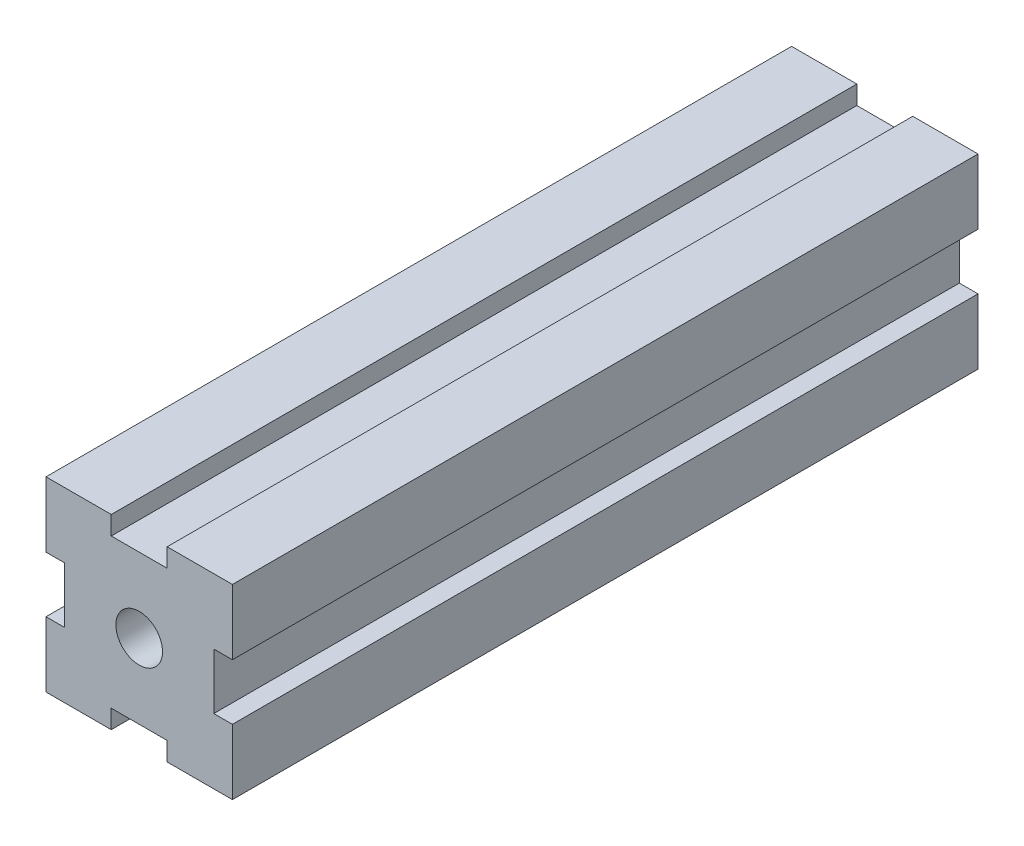
ISO-10303-21;
HEADER;
FILE_DESCRIPTION(('STEP AP214'),'2;1');
FILE_NAME('part.step','',(''),(''),'','','');
FILE_SCHEMA(('AUTOMOTIVE_DESIGN { 1 0 10303 214 1 1 1 1 }'));
ENDSEC;
DATA;
#1=APPLICATION_CONTEXT('core data for automotive mechanical design processes');
#2=APPLICATION_PROTOCOL_DEFINITION('international standard','automotive_design',2000,#1);
#3=PRODUCT_CONTEXT('',#1,'mechanical');
#4=PRODUCT('Part','Part','',(#3));
#5=PRODUCT_RELATED_PRODUCT_CATEGORY('part','',(#4));
#6=PRODUCT_DEFINITION_FORMATION('','',#4);
#7=PRODUCT_DEFINITION_CONTEXT('part definition',#1,'design');
#8=PRODUCT_DEFINITION('design','',#6,#7);
#9=PRODUCT_DEFINITION_SHAPE('','',#8);
#10=(LENGTH_UNIT() NAMED_UNIT(*) SI_UNIT(.MILLI.,.METRE.));
#11=(NAMED_UNIT(*) PLANE_ANGLE_UNIT() SI_UNIT($,.RADIAN.));
#12=(NAMED_UNIT(*) SI_UNIT($,.STERADIAN.) SOLID_ANGLE_UNIT());
#13=UNCERTAINTY_MEASURE_WITH_UNIT(LENGTH_MEASURE(1.E-05),#10,'distance_accuracy_value','');
#14=(GEOMETRIC_REPRESENTATION_CONTEXT(3) GLOBAL_UNCERTAINTY_ASSIGNED_CONTEXT((#13)) GLOBAL_UNIT_ASSIGNED_CONTEXT((#10,
#11,#12)) REPRESENTATION_CONTEXT('',''));
#15=CARTESIAN_POINT('',(0.,0.,0.));
#16=DIRECTION('',(0.,0.,1.));
#17=DIRECTION('',(1.,0.,0.));
#18=AXIS2_PLACEMENT_3D('',#15,#16,#17);
#19=CARTESIAN_POINT('',(0.,0.,80.));
#20=DIRECTION('',(0.,0.,1.));
#21=DIRECTION('',(1.,0.,0.));
#22=AXIS2_PLACEMENT_3D('',#19,#20,#21);
#23=PLANE('',#22);
#24=DIRECTION('',(0.,-1.,0.));
#25=VECTOR('',#24,1.);
#26=CARTESIAN_POINT('',(0.,0.,80.));
#27=LINE('',#26,#25);
#28=CARTESIAN_POINT('',(0.,0.,80.));
#29=VERTEX_POINT('',#28);
#30=CARTESIAN_POINT('',(0.,-7.,80.));
#31=VERTEX_POINT('',#30);
#32=EDGE_CURVE('E242',#29,#31,#27,.T.);
#33=ORIENTED_EDGE('',*,*,#32,.T.);
#34=DIRECTION('',(1.,0.,0.));
#35=VECTOR('',#34,1.);
#36=CARTESIAN_POINT('',(0.,-7.,80.));
#37=LINE('',#36,#35);
#38=CARTESIAN_POINT('',(2.,-7.,80.));
#39=VERTEX_POINT('',#38);
#40=EDGE_CURVE('E130',#31,#39,#37,.T.);
#41=ORIENTED_EDGE('',*,*,#40,.T.);
#42=DIRECTION('',(0.,-1.,0.));
#43=VECTOR('',#42,1.);
#44=CARTESIAN_POINT('',(2.,-7.,80.));
#45=LINE('',#44,#43);
#46=CARTESIAN_POINT('',(2.,-13.,80.));
#47=VERTEX_POINT('',#46);
#48=EDGE_CURVE('E293',#39,#47,#45,.T.);
#49=ORIENTED_EDGE('',*,*,#48,.T.);
#50=DIRECTION('',(-1.,0.,0.));
#51=VECTOR('',#50,1.);
#52=CARTESIAN_POINT('',(0.,-13.,80.));
#53=LINE('',#52,#51);
#54=CARTESIAN_POINT('',(0.,-13.,80.));
#55=VERTEX_POINT('',#54);
#56=EDGE_CURVE('E312',#47,#55,#53,.T.);
#57=ORIENTED_EDGE('',*,*,#56,.T.);
#58=DIRECTION('',(0.,-1.,0.));
#59=VECTOR('',#58,1.);
#60=CARTESIAN_POINT('',(0.,-13.,80.));
#61=LINE('',#60,#59);
#62=CARTESIAN_POINT('',(0.,-20.,80.));
#63=VERTEX_POINT('',#62);
#64=EDGE_CURVE('E309',#55,#63,#61,.T.);
#65=ORIENTED_EDGE('',*,*,#64,.T.);
#66=DIRECTION('',(1.,0.,0.));
#67=VECTOR('',#66,1.);
#68=CARTESIAN_POINT('',(0.,-20.,80.));
#69=LINE('',#68,#67);
#70=CARTESIAN_POINT('',(7.,-20.,80.));
#71=VERTEX_POINT('',#70);
#72=EDGE_CURVE('E311',#63,#71,#69,.T.);
#73=ORIENTED_EDGE('',*,*,#72,.T.);
#74=DIRECTION('',(0.,1.,0.));
#75=VECTOR('',#74,1.);
#76=CARTESIAN_POINT('',(7.,-20.,80.));
#77=LINE('',#76,#75);
#78=CARTESIAN_POINT('',(7.,-18.,80.));
#79=VERTEX_POINT('',#78);
#80=EDGE_CURVE('E314',#71,#79,#77,.T.);
#81=ORIENTED_EDGE('',*,*,#80,.T.);
#82=DIRECTION('',(1.,0.,0.));
#83=VECTOR('',#82,1.);
#84=CARTESIAN_POINT('',(7.,-18.,80.));
#85=LINE('',#84,#83);
#86=CARTESIAN_POINT('',(13.,-18.,80.));
#87=VERTEX_POINT('',#86);
#88=EDGE_CURVE('E320',#79,#87,#85,.T.);
#89=ORIENTED_EDGE('',*,*,#88,.T.);
#90=DIRECTION('',(0.,-1.,0.));
#91=VECTOR('',#90,1.);
#92=CARTESIAN_POINT('',(13.,-20.,80.));
#93=LINE('',#92,#91);
#94=CARTESIAN_POINT('',(13.,-20.,80.));
#95=VERTEX_POINT('',#94);
#96=EDGE_CURVE('E322',#87,#95,#93,.T.);
#97=ORIENTED_EDGE('',*,*,#96,.T.);
#98=DIRECTION('',(1.,0.,0.));
#99=VECTOR('',#98,1.);
#100=CARTESIAN_POINT('',(13.,-20.,80.));
#101=LINE('',#100,#99);
#102=CARTESIAN_POINT('',(20.,-20.,80.));
#103=VERTEX_POINT('',#102);
#104=EDGE_CURVE('E324',#95,#103,#101,.T.);
#105=ORIENTED_EDGE('',*,*,#104,.T.);
#106=DIRECTION('',(0.,1.,0.));
#107=VECTOR('',#106,1.);
#108=CARTESIAN_POINT('',(20.,-13.,80.));
#109=LINE('',#108,#107);
#110=CARTESIAN_POINT('',(20.,-13.,80.));
#111=VERTEX_POINT('',#110);
#112=EDGE_CURVE('E326',#103,#111,#109,.T.);
#113=ORIENTED_EDGE('',*,*,#112,.T.);
#114=DIRECTION('',(-1.,0.,0.));
#115=VECTOR('',#114,1.);
#116=CARTESIAN_POINT('',(20.,-13.,80.));
#117=LINE('',#116,#115);
#118=CARTESIAN_POINT('',(18.,-13.,80.));
#119=VERTEX_POINT('',#118);
#120=EDGE_CURVE('E328',#111,#119,#117,.T.);
#121=ORIENTED_EDGE('',*,*,#120,.T.);
#122=DIRECTION('',(0.,1.,0.));
#123=VECTOR('',#122,1.);
#124=CARTESIAN_POINT('',(18.,-7.,80.));
#125=LINE('',#124,#123);
#126=CARTESIAN_POINT('',(18.,-7.,80.));
#127=VERTEX_POINT('',#126);
#128=EDGE_CURVE('E330',#119,#127,#125,.T.);
#129=ORIENTED_EDGE('',*,*,#128,.T.);
#130=DIRECTION('',(1.,0.,0.));
#131=VECTOR('',#130,1.);
#132=CARTESIAN_POINT('',(20.,-7.,80.));
#133=LINE('',#132,#131);
#134=CARTESIAN_POINT('',(20.,-7.,80.));
#135=VERTEX_POINT('',#134);
#136=EDGE_CURVE('E332',#127,#135,#133,.T.);
#137=ORIENTED_EDGE('',*,*,#136,.T.);
#138=DIRECTION('',(0.,1.,0.));
#139=VECTOR('',#138,1.);
#140=CARTESIAN_POINT('',(20.,0.,80.));
#141=LINE('',#140,#139);
#142=CARTESIAN_POINT('',(20.,0.,80.));
#143=VERTEX_POINT('',#142);
#144=EDGE_CURVE('E334',#135,#143,#141,.T.);
#145=ORIENTED_EDGE('',*,*,#144,.T.);
#146=DIRECTION('',(-1.,0.,0.));
#147=VECTOR('',#146,1.);
#148=CARTESIAN_POINT('',(13.,0.,80.));
#149=LINE('',#148,#147);
#150=CARTESIAN_POINT('',(13.,0.,80.));
#151=VERTEX_POINT('',#150);
#152=EDGE_CURVE('E336',#143,#151,#149,.T.);
#153=ORIENTED_EDGE('',*,*,#152,.T.);
#154=DIRECTION('',(0.,-1.,0.));
#155=VECTOR('',#154,1.);
#156=CARTESIAN_POINT('',(13.,0.,80.));
#157=LINE('',#156,#155);
#158=CARTESIAN_POINT('',(13.,-2.,80.));
#159=VERTEX_POINT('',#158);
#160=EDGE_CURVE('E185',#151,#159,#157,.T.);
#161=ORIENTED_EDGE('',*,*,#160,.T.);
#162=DIRECTION('',(-1.,0.,0.));
#163=VECTOR('',#162,1.);
#164=CARTESIAN_POINT('',(7.,-2.,80.));
#165=LINE('',#164,#163);
#166=CARTESIAN_POINT('',(7.,-2.,80.));
#167=VERTEX_POINT('',#166);
#168=EDGE_CURVE('E179',#159,#167,#165,.T.);
#169=ORIENTED_EDGE('',*,*,#168,.T.);
#170=DIRECTION('',(0.,1.,0.));
#171=VECTOR('',#170,1.);
#172=CARTESIAN_POINT('',(7.,0.,80.));
#173=LINE('',#172,#171);
#174=CARTESIAN_POINT('',(7.,0.,80.));
#175=VERTEX_POINT('',#174);
#176=EDGE_CURVE('E183',#167,#175,#173,.T.);
#177=ORIENTED_EDGE('',*,*,#176,.T.);
#178=DIRECTION('',(-1.,0.,0.));
#179=VECTOR('',#178,1.);
#180=CARTESIAN_POINT('',(0.,0.,80.));
#181=LINE('',#180,#179);
#182=EDGE_CURVE('E51',#175,#29,#181,.T.);
#183=ORIENTED_EDGE('',*,*,#182,.T.);
#184=EDGE_LOOP('',(#33,#41,#49,#57,#65,#73,#81,#89,#97,#105,#113,#121,#129,#137,#145,#153,#161,
#169,#177,#183));
#185=FACE_BOUND('',#184,.T.);
#186=CARTESIAN_POINT('',(10.,-10.,80.));
#187=DIRECTION('',(0.,0.,1.));
#188=DIRECTION('',(1.,0.,0.));
#189=AXIS2_PLACEMENT_3D('',#186,#187,#188);
#190=CIRCLE('',#189,2.5);
#191=CARTESIAN_POINT('',(12.5,-10.,80.));
#192=VERTEX_POINT('',#191);
#193=EDGE_CURVE('E207',#192,#192,#190,.T.);
#194=ORIENTED_EDGE('',*,*,#193,.F.);
#195=EDGE_LOOP('',(#194));
#196=FACE_BOUND('',#195,.T.);
#197=ADVANCED_FACE('F34',(#185,#196),#23,.T.);
#198=CARTESIAN_POINT('',(0.,0.,0.));
#199=DIRECTION('',(0.,0.,1.));
#200=DIRECTION('',(1.,0.,0.));
#201=AXIS2_PLACEMENT_3D('',#198,#199,#200);
#202=PLANE('',#201);
#203=DIRECTION('',(0.,-1.,0.));
#204=VECTOR('',#203,1.);
#205=CARTESIAN_POINT('',(0.,0.,0.));
#206=LINE('',#205,#204);
#207=CARTESIAN_POINT('',(0.,0.,0.));
#208=VERTEX_POINT('',#207);
#209=CARTESIAN_POINT('',(0.,-7.,0.));
#210=VERTEX_POINT('',#209);
#211=EDGE_CURVE('E203',#208,#210,#206,.T.);
#212=ORIENTED_EDGE('',*,*,#211,.F.);
#213=DIRECTION('',(-1.,0.,0.));
#214=VECTOR('',#213,1.);
#215=CARTESIAN_POINT('',(0.,0.,0.));
#216=LINE('',#215,#214);
#217=CARTESIAN_POINT('',(7.,0.,0.));
#218=VERTEX_POINT('',#217);
#219=EDGE_CURVE('E122',#218,#208,#216,.T.);
#220=ORIENTED_EDGE('',*,*,#219,.F.);
#221=DIRECTION('',(0.,1.,0.));
#222=VECTOR('',#221,1.);
#223=CARTESIAN_POINT('',(7.,0.,0.));
#224=LINE('',#223,#222);
#225=CARTESIAN_POINT('',(7.,-2.,0.));
#226=VERTEX_POINT('',#225);
#227=EDGE_CURVE('E116',#226,#218,#224,.T.);
#228=ORIENTED_EDGE('',*,*,#227,.F.);
#229=DIRECTION('',(-1.,0.,0.));
#230=VECTOR('',#229,1.);
#231=CARTESIAN_POINT('',(7.,-2.,0.));
#232=LINE('',#231,#230);
#233=CARTESIAN_POINT('',(13.,-2.,0.));
#234=VERTEX_POINT('',#233);
#235=EDGE_CURVE('E193',#234,#226,#232,.T.);
#236=ORIENTED_EDGE('',*,*,#235,.F.);
#237=DIRECTION('',(0.,-1.,0.));
#238=VECTOR('',#237,1.);
#239=CARTESIAN_POINT('',(13.,0.,0.));
#240=LINE('',#239,#238);
#241=CARTESIAN_POINT('',(13.,0.,0.));
#242=VERTEX_POINT('',#241);
#243=EDGE_CURVE('E237',#242,#234,#240,.T.);
#244=ORIENTED_EDGE('',*,*,#243,.F.);
#245=DIRECTION('',(-1.,0.,0.));
#246=VECTOR('',#245,1.);
#247=CARTESIAN_POINT('',(13.,0.,0.));
#248=LINE('',#247,#246);
#249=CARTESIAN_POINT('',(20.,0.,0.));
#250=VERTEX_POINT('',#249);
#251=EDGE_CURVE('E235',#250,#242,#248,.T.);
#252=ORIENTED_EDGE('',*,*,#251,.F.);
#253=DIRECTION('',(0.,1.,0.));
#254=VECTOR('',#253,1.);
#255=CARTESIAN_POINT('',(20.,0.,0.));
#256=LINE('',#255,#254);
#257=CARTESIAN_POINT('',(20.,-7.,0.));
#258=VERTEX_POINT('',#257);
#259=EDGE_CURVE('E233',#258,#250,#256,.T.);
#260=ORIENTED_EDGE('',*,*,#259,.F.);
#261=DIRECTION('',(1.,0.,0.));
#262=VECTOR('',#261,1.);
#263=CARTESIAN_POINT('',(20.,-7.,0.));
#264=LINE('',#263,#262);
#265=CARTESIAN_POINT('',(18.,-7.,0.));
#266=VERTEX_POINT('',#265);
#267=EDGE_CURVE('E231',#266,#258,#264,.T.);
#268=ORIENTED_EDGE('',*,*,#267,.F.);
#269=DIRECTION('',(0.,1.,0.));
#270=VECTOR('',#269,1.);
#271=CARTESIAN_POINT('',(18.,-7.,0.));
#272=LINE('',#271,#270);
#273=CARTESIAN_POINT('',(18.,-13.,0.));
#274=VERTEX_POINT('',#273);
#275=EDGE_CURVE('E229',#274,#266,#272,.T.);
#276=ORIENTED_EDGE('',*,*,#275,.F.);
#277=DIRECTION('',(-1.,0.,0.));
#278=VECTOR('',#277,1.);
#279=CARTESIAN_POINT('',(20.,-13.,0.));
#280=LINE('',#279,#278);
#281=CARTESIAN_POINT('',(20.,-13.,0.));
#282=VERTEX_POINT('',#281);
#283=EDGE_CURVE('E227',#282,#274,#280,.T.);
#284=ORIENTED_EDGE('',*,*,#283,.F.);
#285=DIRECTION('',(0.,1.,0.));
#286=VECTOR('',#285,1.);
#287=CARTESIAN_POINT('',(20.,-13.,0.));
#288=LINE('',#287,#286);
#289=CARTESIAN_POINT('',(20.,-20.,0.));
#290=VERTEX_POINT('',#289);
#291=EDGE_CURVE('E225',#290,#282,#288,.T.);
#292=ORIENTED_EDGE('',*,*,#291,.F.);
#293=DIRECTION('',(1.,0.,0.));
#294=VECTOR('',#293,1.);
#295=CARTESIAN_POINT('',(13.,-20.,0.));
#296=LINE('',#295,#294);
#297=CARTESIAN_POINT('',(13.,-20.,0.));
#298=VERTEX_POINT('',#297);
#299=EDGE_CURVE('E223',#298,#290,#296,.T.);
#300=ORIENTED_EDGE('',*,*,#299,.F.);
#301=DIRECTION('',(0.,-1.,0.));
#302=VECTOR('',#301,1.);
#303=CARTESIAN_POINT('',(13.,-20.,0.));
#304=LINE('',#303,#302);
#305=CARTESIAN_POINT('',(13.,-18.,0.));
#306=VERTEX_POINT('',#305);
#307=EDGE_CURVE('E221',#306,#298,#304,.T.);
#308=ORIENTED_EDGE('',*,*,#307,.F.);
#309=DIRECTION('',(1.,0.,0.));
#310=VECTOR('',#309,1.);
#311=CARTESIAN_POINT('',(7.,-18.,0.));
#312=LINE('',#311,#310);
#313=CARTESIAN_POINT('',(7.,-18.,0.));
#314=VERTEX_POINT('',#313);
#315=EDGE_CURVE('E219',#314,#306,#312,.T.);
#316=ORIENTED_EDGE('',*,*,#315,.F.);
#317=DIRECTION('',(0.,1.,0.));
#318=VECTOR('',#317,1.);
#319=CARTESIAN_POINT('',(7.,-20.,0.));
#320=LINE('',#319,#318);
#321=CARTESIAN_POINT('',(7.,-20.,0.));
#322=VERTEX_POINT('',#321);
#323=EDGE_CURVE('E217',#322,#314,#320,.T.);
#324=ORIENTED_EDGE('',*,*,#323,.F.);
#325=DIRECTION('',(1.,0.,0.));
#326=VECTOR('',#325,1.);
#327=CARTESIAN_POINT('',(0.,-20.,0.));
#328=LINE('',#327,#326);
#329=CARTESIAN_POINT('',(0.,-20.,0.));
#330=VERTEX_POINT('',#329);
#331=EDGE_CURVE('E215',#330,#322,#328,.T.);
#332=ORIENTED_EDGE('',*,*,#331,.F.);
#333=DIRECTION('',(0.,-1.,0.));
#334=VECTOR('',#333,1.);
#335=CARTESIAN_POINT('',(0.,-13.,0.));
#336=LINE('',#335,#334);
#337=CARTESIAN_POINT('',(0.,-13.,0.));
#338=VERTEX_POINT('',#337);
#339=EDGE_CURVE('E213',#338,#330,#336,.T.);
#340=ORIENTED_EDGE('',*,*,#339,.F.);
#341=DIRECTION('',(-1.,0.,0.));
#342=VECTOR('',#341,1.);
#343=CARTESIAN_POINT('',(0.,-13.,0.));
#344=LINE('',#343,#342);
#345=CARTESIAN_POINT('',(2.,-13.,0.));
#346=VERTEX_POINT('',#345);
#347=EDGE_CURVE('E211',#346,#338,#344,.T.);
#348=ORIENTED_EDGE('',*,*,#347,.F.);
#349=DIRECTION('',(0.,-1.,0.));
#350=VECTOR('',#349,1.);
#351=CARTESIAN_POINT('',(2.,-7.,0.));
#352=LINE('',#351,#350);
#353=CARTESIAN_POINT('',(2.,-7.,0.));
#354=VERTEX_POINT('',#353);
#355=EDGE_CURVE('E209',#354,#346,#352,.T.);
#356=ORIENTED_EDGE('',*,*,#355,.F.);
#357=DIRECTION('',(1.,0.,0.));
#358=VECTOR('',#357,1.);
#359=CARTESIAN_POINT('',(0.,-7.,0.));
#360=LINE('',#359,#358);
#361=EDGE_CURVE('E206',#210,#354,#360,.T.);
#362=ORIENTED_EDGE('',*,*,#361,.F.);
#363=EDGE_LOOP('',(#212,#220,#228,#236,#244,#252,#260,#268,#276,#284,#292,#300,#308,#316,#324,
#332,#340,#348,#356,#362));
#364=FACE_BOUND('',#363,.T.);
#365=CARTESIAN_POINT('',(10.,-10.,0.));
#366=DIRECTION('',(0.,0.,1.));
#367=DIRECTION('',(1.,0.,0.));
#368=AXIS2_PLACEMENT_3D('',#365,#366,#367);
#369=CIRCLE('',#368,2.5);
#370=CARTESIAN_POINT('',(12.5,-10.,0.));
#371=VERTEX_POINT('',#370);
#372=EDGE_CURVE('E587',#371,#371,#369,.T.);
#373=ORIENTED_EDGE('',*,*,#372,.T.);
#374=EDGE_LOOP('',(#373));
#375=FACE_BOUND('',#374,.T.);
#376=ADVANCED_FACE('F297',(#364,#375),#202,.F.);
#377=CARTESIAN_POINT('',(0.,0.,80.));
#378=DIRECTION('',(1.,0.,0.));
#379=DIRECTION('',(0.,1.,0.));
#380=AXIS2_PLACEMENT_3D('',#377,#378,#379);
#381=PLANE('',#380);
#382=ORIENTED_EDGE('',*,*,#211,.T.);
#383=DIRECTION('',(0.,0.,-1.));
#384=VECTOR('',#383,1.);
#385=CARTESIAN_POINT('',(0.,-7.,80.));
#386=LINE('',#385,#384);
#387=EDGE_CURVE('E11',#31,#210,#386,.T.);
#388=ORIENTED_EDGE('',*,*,#387,.F.);
#389=ORIENTED_EDGE('',*,*,#32,.F.);
#390=DIRECTION('',(0.,0.,-1.));
#391=VECTOR('',#390,1.);
#392=CARTESIAN_POINT('',(0.,0.,80.));
#393=LINE('',#392,#391);
#394=EDGE_CURVE('E199',#29,#208,#393,.T.);
#395=ORIENTED_EDGE('',*,*,#394,.T.);
#396=EDGE_LOOP('',(#382,#388,#389,#395));
#397=FACE_BOUND('',#396,.T.);
#398=ADVANCED_FACE('F36',(#397),#381,.F.);
#399=CARTESIAN_POINT('',(0.,-7.,80.));
#400=DIRECTION('',(0.,1.,0.));
#401=DIRECTION('',(-1.,0.,0.));
#402=AXIS2_PLACEMENT_3D('',#399,#400,#401);
#403=PLANE('',#402);
#404=ORIENTED_EDGE('',*,*,#361,.T.);
#405=DIRECTION('',(0.,0.,-1.));
#406=VECTOR('',#405,1.);
#407=CARTESIAN_POINT('',(2.,-7.,80.));
#408=LINE('',#407,#406);
#409=EDGE_CURVE('E43',#39,#354,#408,.T.);
#410=ORIENTED_EDGE('',*,*,#409,.F.);
#411=ORIENTED_EDGE('',*,*,#40,.F.);
#412=ORIENTED_EDGE('',*,*,#387,.T.);
#413=EDGE_LOOP('',(#404,#410,#411,#412));
#414=FACE_BOUND('',#413,.T.);
#415=ADVANCED_FACE('F370',(#414),#403,.F.);
#416=CARTESIAN_POINT('',(2.,-7.,80.));
#417=DIRECTION('',(1.,0.,0.));
#418=DIRECTION('',(0.,0.,-1.));
#419=AXIS2_PLACEMENT_3D('',#416,#417,#418);
#420=PLANE('',#419);
#421=ORIENTED_EDGE('',*,*,#355,.T.);
#422=DIRECTION('',(0.,0.,-1.));
#423=VECTOR('',#422,1.);
#424=CARTESIAN_POINT('',(2.,-13.,80.));
#425=LINE('',#424,#423);
#426=EDGE_CURVE('E285',#47,#346,#425,.T.);
#427=ORIENTED_EDGE('',*,*,#426,.F.);
#428=ORIENTED_EDGE('',*,*,#48,.F.);
#429=ORIENTED_EDGE('',*,*,#409,.T.);
#430=EDGE_LOOP('',(#421,#427,#428,#429));
#431=FACE_BOUND('',#430,.T.);
#432=ADVANCED_FACE('F291',(#431),#420,.F.);
#433=CARTESIAN_POINT('',(0.,-13.,80.));
#434=DIRECTION('',(0.,-1.,0.));
#435=DIRECTION('',(1.,0.,0.));
#436=AXIS2_PLACEMENT_3D('',#433,#434,#435);
#437=PLANE('',#436);
#438=ORIENTED_EDGE('',*,*,#347,.T.);
#439=DIRECTION('',(0.,0.,-1.));
#440=VECTOR('',#439,1.);
#441=CARTESIAN_POINT('',(0.,-13.,80.));
#442=LINE('',#441,#440);
#443=EDGE_CURVE('E282',#55,#338,#442,.T.);
#444=ORIENTED_EDGE('',*,*,#443,.F.);
#445=ORIENTED_EDGE('',*,*,#56,.F.);
#446=ORIENTED_EDGE('',*,*,#426,.T.);
#447=EDGE_LOOP('',(#438,#444,#445,#446));
#448=FACE_BOUND('',#447,.T.);
#449=ADVANCED_FACE('F303',(#448),#437,.F.);
#450=CARTESIAN_POINT('',(0.,-13.,80.));
#451=DIRECTION('',(1.,0.,0.));
#452=DIRECTION('',(0.,1.,0.));
#453=AXIS2_PLACEMENT_3D('',#450,#451,#452);
#454=PLANE('',#453);
#455=ORIENTED_EDGE('',*,*,#339,.T.);
#456=DIRECTION('',(0.,0.,-1.));
#457=VECTOR('',#456,1.);
#458=CARTESIAN_POINT('',(0.,-20.,80.));
#459=LINE('',#458,#457);
#460=EDGE_CURVE('E279',#63,#330,#459,.T.);
#461=ORIENTED_EDGE('',*,*,#460,.F.);
#462=ORIENTED_EDGE('',*,*,#64,.F.);
#463=ORIENTED_EDGE('',*,*,#443,.T.);
#464=EDGE_LOOP('',(#455,#461,#462,#463));
#465=FACE_BOUND('',#464,.T.);
#466=ADVANCED_FACE('F307',(#465),#454,.F.);
#467=CARTESIAN_POINT('',(0.,-20.,80.));
#468=DIRECTION('',(0.,1.,0.));
#469=DIRECTION('',(0.,0.,1.));
#470=AXIS2_PLACEMENT_3D('',#467,#468,#469);
#471=PLANE('',#470);
#472=ORIENTED_EDGE('',*,*,#331,.T.);
#473=DIRECTION('',(0.,0.,-1.));
#474=VECTOR('',#473,1.);
#475=CARTESIAN_POINT('',(7.,-20.,80.));
#476=LINE('',#475,#474);
#477=EDGE_CURVE('E276',#71,#322,#476,.T.);
#478=ORIENTED_EDGE('',*,*,#477,.F.);
#479=ORIENTED_EDGE('',*,*,#72,.F.);
#480=ORIENTED_EDGE('',*,*,#460,.T.);
#481=EDGE_LOOP('',(#472,#478,#479,#480));
#482=FACE_BOUND('',#481,.T.);
#483=ADVANCED_FACE('F383',(#482),#471,.F.);
#484=CARTESIAN_POINT('',(7.,-20.,80.));
#485=DIRECTION('',(-1.,0.,0.));
#486=DIRECTION('',(0.,-1.,0.));
#487=AXIS2_PLACEMENT_3D('',#484,#485,#486);
#488=PLANE('',#487);
#489=ORIENTED_EDGE('',*,*,#323,.T.);
#490=DIRECTION('',(0.,0.,-1.));
#491=VECTOR('',#490,1.);
#492=CARTESIAN_POINT('',(7.,-18.,80.));
#493=LINE('',#492,#491);
#494=EDGE_CURVE('E273',#79,#314,#493,.T.);
#495=ORIENTED_EDGE('',*,*,#494,.F.);
#496=ORIENTED_EDGE('',*,*,#80,.F.);
#497=ORIENTED_EDGE('',*,*,#477,.T.);
#498=EDGE_LOOP('',(#489,#495,#496,#497));
#499=FACE_BOUND('',#498,.T.);
#500=ADVANCED_FACE('F386',(#499),#488,.F.);
#501=CARTESIAN_POINT('',(7.,-18.,80.));
#502=DIRECTION('',(0.,1.,0.));
#503=DIRECTION('',(0.,0.,1.));
#504=AXIS2_PLACEMENT_3D('',#501,#502,#503);
#505=PLANE('',#504);
#506=ORIENTED_EDGE('',*,*,#315,.T.);
#507=DIRECTION('',(0.,0.,-1.));
#508=VECTOR('',#507,1.);
#509=CARTESIAN_POINT('',(13.,-18.,80.));
#510=LINE('',#509,#508);
#511=EDGE_CURVE('E270',#87,#306,#510,.T.);
#512=ORIENTED_EDGE('',*,*,#511,.F.);
#513=ORIENTED_EDGE('',*,*,#88,.F.);
#514=ORIENTED_EDGE('',*,*,#494,.T.);
#515=EDGE_LOOP('',(#506,#512,#513,#514));
#516=FACE_BOUND('',#515,.T.);
#517=ADVANCED_FACE('F390',(#516),#505,.F.);
#518=CARTESIAN_POINT('',(13.,-20.,80.));
#519=DIRECTION('',(1.,0.,0.));
#520=DIRECTION('',(0.,1.,0.));
#521=AXIS2_PLACEMENT_3D('',#518,#519,#520);
#522=PLANE('',#521);
#523=ORIENTED_EDGE('',*,*,#307,.T.);
#524=DIRECTION('',(0.,0.,-1.));
#525=VECTOR('',#524,1.);
#526=CARTESIAN_POINT('',(13.,-20.,80.));
#527=LINE('',#526,#525);
#528=EDGE_CURVE('E267',#95,#298,#527,.T.);
#529=ORIENTED_EDGE('',*,*,#528,.F.);
#530=ORIENTED_EDGE('',*,*,#96,.F.);
#531=ORIENTED_EDGE('',*,*,#511,.T.);
#532=EDGE_LOOP('',(#523,#529,#530,#531));
#533=FACE_BOUND('',#532,.T.);
#534=ADVANCED_FACE('F394',(#533),#522,.F.);
#535=CARTESIAN_POINT('',(13.,-20.,80.));
#536=DIRECTION('',(0.,1.,0.));
#537=DIRECTION('',(0.,0.,1.));
#538=AXIS2_PLACEMENT_3D('',#535,#536,#537);
#539=PLANE('',#538);
#540=ORIENTED_EDGE('',*,*,#299,.T.);
#541=DIRECTION('',(0.,0.,-1.));
#542=VECTOR('',#541,1.);
#543=CARTESIAN_POINT('',(20.,-20.,80.));
#544=LINE('',#543,#542);
#545=EDGE_CURVE('E264',#103,#290,#544,.T.);
#546=ORIENTED_EDGE('',*,*,#545,.F.);
#547=ORIENTED_EDGE('',*,*,#104,.F.);
#548=ORIENTED_EDGE('',*,*,#528,.T.);
#549=EDGE_LOOP('',(#540,#546,#547,#548));
#550=FACE_BOUND('',#549,.T.);
#551=ADVANCED_FACE('F398',(#550),#539,.F.);
#552=CARTESIAN_POINT('',(20.,-13.,80.));
#553=DIRECTION('',(-1.,0.,0.));
#554=DIRECTION('',(0.,0.,1.));
#555=AXIS2_PLACEMENT_3D('',#552,#553,#554);
#556=PLANE('',#555);
#557=ORIENTED_EDGE('',*,*,#291,.T.);
#558=DIRECTION('',(0.,0.,-1.));
#559=VECTOR('',#558,1.);
#560=CARTESIAN_POINT('',(20.,-13.,80.));
#561=LINE('',#560,#559);
#562=EDGE_CURVE('E261',#111,#282,#561,.T.);
#563=ORIENTED_EDGE('',*,*,#562,.F.);
#564=ORIENTED_EDGE('',*,*,#112,.F.);
#565=ORIENTED_EDGE('',*,*,#545,.T.);
#566=EDGE_LOOP('',(#557,#563,#564,#565));
#567=FACE_BOUND('',#566,.T.);
#568=ADVANCED_FACE('F402',(#567),#556,.F.);
#569=CARTESIAN_POINT('',(20.,-13.,80.));
#570=DIRECTION('',(0.,-1.,0.));
#571=DIRECTION('',(1.,0.,0.));
#572=AXIS2_PLACEMENT_3D('',#569,#570,#571);
#573=PLANE('',#572);
#574=ORIENTED_EDGE('',*,*,#283,.T.);
#575=DIRECTION('',(0.,0.,-1.));
#576=VECTOR('',#575,1.);
#577=CARTESIAN_POINT('',(18.,-13.,80.));
#578=LINE('',#577,#576);
#579=EDGE_CURVE('E258',#119,#274,#578,.T.);
#580=ORIENTED_EDGE('',*,*,#579,.F.);
#581=ORIENTED_EDGE('',*,*,#120,.F.);
#582=ORIENTED_EDGE('',*,*,#562,.T.);
#583=EDGE_LOOP('',(#574,#580,#581,#582));
#584=FACE_BOUND('',#583,.T.);
#585=ADVANCED_FACE('F406',(#584),#573,.F.);
#586=CARTESIAN_POINT('',(18.,-7.,80.));
#587=DIRECTION('',(-1.,0.,0.));
#588=DIRECTION('',(0.,0.,1.));
#589=AXIS2_PLACEMENT_3D('',#586,#587,#588);
#590=PLANE('',#589);
#591=ORIENTED_EDGE('',*,*,#275,.T.);
#592=DIRECTION('',(0.,0.,-1.));
#593=VECTOR('',#592,1.);
#594=CARTESIAN_POINT('',(18.,-7.,80.));
#595=LINE('',#594,#593);
#596=EDGE_CURVE('E255',#127,#266,#595,.T.);
#597=ORIENTED_EDGE('',*,*,#596,.F.);
#598=ORIENTED_EDGE('',*,*,#128,.F.);
#599=ORIENTED_EDGE('',*,*,#579,.T.);
#600=EDGE_LOOP('',(#591,#597,#598,#599));
#601=FACE_BOUND('',#600,.T.);
#602=ADVANCED_FACE('F410',(#601),#590,.F.);
#603=CARTESIAN_POINT('',(20.,-7.,80.));
#604=DIRECTION('',(0.,1.,0.));
#605=DIRECTION('',(-1.,0.,0.));
#606=AXIS2_PLACEMENT_3D('',#603,#604,#605);
#607=PLANE('',#606);
#608=ORIENTED_EDGE('',*,*,#267,.T.);
#609=DIRECTION('',(0.,0.,-1.));
#610=VECTOR('',#609,1.);
#611=CARTESIAN_POINT('',(20.,-7.,80.));
#612=LINE('',#611,#610);
#613=EDGE_CURVE('E252',#135,#258,#612,.T.);
#614=ORIENTED_EDGE('',*,*,#613,.F.);
#615=ORIENTED_EDGE('',*,*,#136,.F.);
#616=ORIENTED_EDGE('',*,*,#596,.T.);
#617=EDGE_LOOP('',(#608,#614,#615,#616));
#618=FACE_BOUND('',#617,.T.);
#619=ADVANCED_FACE('F414',(#618),#607,.F.);
#620=CARTESIAN_POINT('',(20.,0.,80.));
#621=DIRECTION('',(-1.,0.,0.));
#622=DIRECTION('',(0.,-1.,0.));
#623=AXIS2_PLACEMENT_3D('',#620,#621,#622);
#624=PLANE('',#623);
#625=ORIENTED_EDGE('',*,*,#259,.T.);
#626=DIRECTION('',(0.,0.,-1.));
#627=VECTOR('',#626,1.);
#628=CARTESIAN_POINT('',(20.,0.,80.));
#629=LINE('',#628,#627);
#630=EDGE_CURVE('E249',#143,#250,#629,.T.);
#631=ORIENTED_EDGE('',*,*,#630,.F.);
#632=ORIENTED_EDGE('',*,*,#144,.F.);
#633=ORIENTED_EDGE('',*,*,#613,.T.);
#634=EDGE_LOOP('',(#625,#631,#632,#633));
#635=FACE_BOUND('',#634,.T.);
#636=ADVANCED_FACE('F418',(#635),#624,.F.);
#637=CARTESIAN_POINT('',(13.,0.,80.));
#638=DIRECTION('',(0.,-1.,0.));
#639=DIRECTION('',(0.,0.,-1.));
#640=AXIS2_PLACEMENT_3D('',#637,#638,#639);
#641=PLANE('',#640);
#642=ORIENTED_EDGE('',*,*,#251,.T.);
#643=DIRECTION('',(0.,0.,-1.));
#644=VECTOR('',#643,1.);
#645=CARTESIAN_POINT('',(13.,0.,80.));
#646=LINE('',#645,#644);
#647=EDGE_CURVE('E246',#151,#242,#646,.T.);
#648=ORIENTED_EDGE('',*,*,#647,.F.);
#649=ORIENTED_EDGE('',*,*,#152,.F.);
#650=ORIENTED_EDGE('',*,*,#630,.T.);
#651=EDGE_LOOP('',(#642,#648,#649,#650));
#652=FACE_BOUND('',#651,.T.);
#653=ADVANCED_FACE('F342',(#652),#641,.F.);
#654=CARTESIAN_POINT('',(13.,0.,80.));
#655=DIRECTION('',(1.,0.,0.));
#656=DIRECTION('',(0.,1.,0.));
#657=AXIS2_PLACEMENT_3D('',#654,#655,#656);
#658=PLANE('',#657);
#659=ORIENTED_EDGE('',*,*,#243,.T.);
#660=DIRECTION('',(0.,0.,-1.));
#661=VECTOR('',#660,1.);
#662=CARTESIAN_POINT('',(13.,-2.,80.));
#663=LINE('',#662,#661);
#664=EDGE_CURVE('E194',#159,#234,#663,.T.);
#665=ORIENTED_EDGE('',*,*,#664,.F.);
#666=ORIENTED_EDGE('',*,*,#160,.F.);
#667=ORIENTED_EDGE('',*,*,#647,.T.);
#668=EDGE_LOOP('',(#659,#665,#666,#667));
#669=FACE_BOUND('',#668,.T.);
#670=ADVANCED_FACE('F346',(#669),#658,.F.);
#671=CARTESIAN_POINT('',(7.,-2.,80.));
#672=DIRECTION('',(0.,-1.,0.));
#673=DIRECTION('',(0.,0.,-1.));
#674=AXIS2_PLACEMENT_3D('',#671,#672,#673);
#675=PLANE('',#674);
#676=ORIENTED_EDGE('',*,*,#235,.T.);
#677=DIRECTION('',(0.,0.,-1.));
#678=VECTOR('',#677,1.);
#679=CARTESIAN_POINT('',(7.,-2.,80.));
#680=LINE('',#679,#678);
#681=EDGE_CURVE('E190',#167,#226,#680,.T.);
#682=ORIENTED_EDGE('',*,*,#681,.F.);
#683=ORIENTED_EDGE('',*,*,#168,.F.);
#684=ORIENTED_EDGE('',*,*,#664,.T.);
#685=EDGE_LOOP('',(#676,#682,#683,#684));
#686=FACE_BOUND('',#685,.T.);
#687=ADVANCED_FACE('F191',(#686),#675,.F.);
#688=CARTESIAN_POINT('',(7.,0.,80.));
#689=DIRECTION('',(-1.,0.,0.));
#690=DIRECTION('',(0.,-1.,0.));
#691=AXIS2_PLACEMENT_3D('',#688,#689,#690);
#692=PLANE('',#691);
#693=ORIENTED_EDGE('',*,*,#227,.T.);
#694=DIRECTION('',(0.,0.,-1.));
#695=VECTOR('',#694,1.);
#696=CARTESIAN_POINT('',(7.,0.,80.));
#697=LINE('',#696,#695);
#698=EDGE_CURVE('E195',#175,#218,#697,.T.);
#699=ORIENTED_EDGE('',*,*,#698,.F.);
#700=ORIENTED_EDGE('',*,*,#176,.F.);
#701=ORIENTED_EDGE('',*,*,#681,.T.);
#702=EDGE_LOOP('',(#693,#699,#700,#701));
#703=FACE_BOUND('',#702,.T.);
#704=ADVANCED_FACE('F197',(#703),#692,.F.);
#705=CARTESIAN_POINT('',(0.,0.,80.));
#706=DIRECTION('',(0.,-1.,0.));
#707=DIRECTION('',(0.,0.,-1.));
#708=AXIS2_PLACEMENT_3D('',#705,#706,#707);
#709=PLANE('',#708);
#710=ORIENTED_EDGE('',*,*,#219,.T.);
#711=ORIENTED_EDGE('',*,*,#394,.F.);
#712=ORIENTED_EDGE('',*,*,#182,.F.);
#713=ORIENTED_EDGE('',*,*,#698,.T.);
#714=EDGE_LOOP('',(#710,#711,#712,#713));
#715=FACE_BOUND('',#714,.T.);
#716=ADVANCED_FACE('F350',(#715),#709,.F.);
#717=CARTESIAN_POINT('',(10.,-10.,80.));
#718=DIRECTION('',(0.,0.,-1.));
#719=DIRECTION('',(-1.,0.,0.));
#720=AXIS2_PLACEMENT_3D('',#717,#718,#719);
#721=CYLINDRICAL_SURFACE('',#720,2.5);
#722=ORIENTED_EDGE('',*,*,#193,.T.);
#723=EDGE_LOOP('',(#722));
#724=FACE_BOUND('',#723,.T.);
#725=ORIENTED_EDGE('',*,*,#372,.F.);
#726=EDGE_LOOP('',(#725));
#727=FACE_BOUND('',#726,.T.);
#728=ADVANCED_FACE('F352',(#724,#727),#721,.F.);
#729=CLOSED_SHELL('',(#197,#376,#398,#415,#432,#449,#466,#483,#500,#517,#534,#551,#568,#585,
#602,#619,#636,#653,#670,#687,#704,#716,#728));
#730=MANIFOLD_SOLID_BREP('B2',#729);
#731=ADVANCED_BREP_SHAPE_REPRESENTATION('',(#18,#730),#14);
#732=SHAPE_DEFINITION_REPRESENTATION(#9,#731);
ENDSEC;
END-ISO-10303-21;
